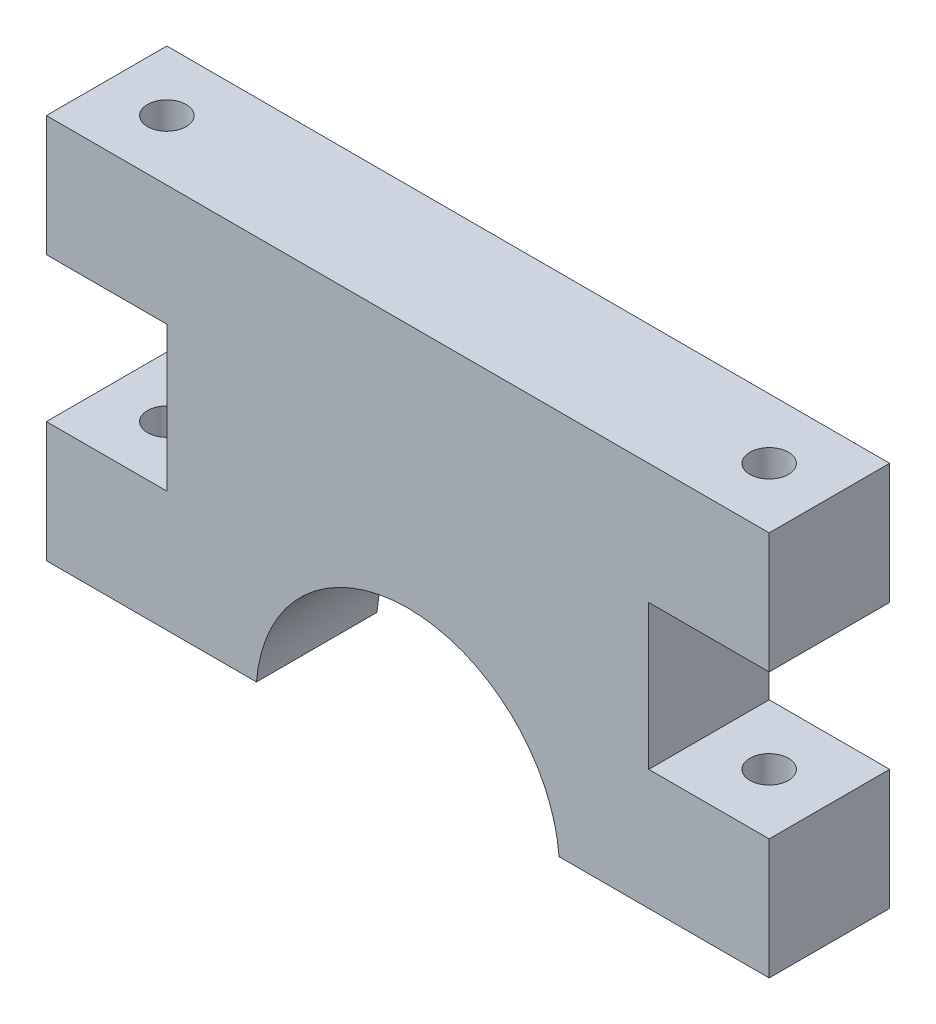
ISO-10303-21;
HEADER;
FILE_DESCRIPTION(('STEP AP214'),'2;1');
FILE_NAME('part.step','',(''),(''),'','','');
FILE_SCHEMA(('AUTOMOTIVE_DESIGN { 1 0 10303 214 1 1 1 1 }'));
ENDSEC;
DATA;
#1=APPLICATION_CONTEXT('core data for automotive mechanical design processes');
#2=APPLICATION_PROTOCOL_DEFINITION('international standard','automotive_design',2000,#1);
#3=PRODUCT_CONTEXT('',#1,'mechanical');
#4=PRODUCT('Part','Part','',(#3));
#5=PRODUCT_RELATED_PRODUCT_CATEGORY('part','',(#4));
#6=PRODUCT_DEFINITION_FORMATION('','',#4);
#7=PRODUCT_DEFINITION_CONTEXT('part definition',#1,'design');
#8=PRODUCT_DEFINITION('design','',#6,#7);
#9=PRODUCT_DEFINITION_SHAPE('','',#8);
#10=(LENGTH_UNIT() NAMED_UNIT(*) SI_UNIT(.MILLI.,.METRE.));
#11=(NAMED_UNIT(*) PLANE_ANGLE_UNIT() SI_UNIT($,.RADIAN.));
#12=(NAMED_UNIT(*) SI_UNIT($,.STERADIAN.) SOLID_ANGLE_UNIT());
#13=UNCERTAINTY_MEASURE_WITH_UNIT(LENGTH_MEASURE(1.E-05),#10,'distance_accuracy_value','');
#14=(GEOMETRIC_REPRESENTATION_CONTEXT(3) GLOBAL_UNCERTAINTY_ASSIGNED_CONTEXT((#13)) GLOBAL_UNIT_ASSIGNED_CONTEXT((#10,
#11,#12)) REPRESENTATION_CONTEXT('',''));
#15=CARTESIAN_POINT('',(0.,0.,0.));
#16=DIRECTION('',(0.,0.,1.));
#17=DIRECTION('',(1.,0.,0.));
#18=AXIS2_PLACEMENT_3D('',#15,#16,#17);
#19=CARTESIAN_POINT('',(0.,16.,10.));
#20=DIRECTION('',(0.,-1.,0.));
#21=DIRECTION('',(0.,0.,-1.));
#22=AXIS2_PLACEMENT_3D('',#19,#20,#21);
#23=PLANE('',#22);
#24=CARTESIAN_POINT('',(-25.,16.,5.));
#25=DIRECTION('',(0.,1.,0.));
#26=DIRECTION('',(0.,0.,1.));
#27=AXIS2_PLACEMENT_3D('',#24,#25,#26);
#28=CIRCLE('',#27,1.6);
#29=CARTESIAN_POINT('',(-25.,16.,6.6));
#30=VERTEX_POINT('',#29);
#31=EDGE_CURVE('E334',#30,#30,#28,.T.);
#32=ORIENTED_EDGE('',*,*,#31,.F.);
#33=EDGE_LOOP('',(#32));
#34=FACE_BOUND('',#33,.T.);
#35=CARTESIAN_POINT('',(25.,16.,5.));
#36=DIRECTION('',(0.,1.,0.));
#37=DIRECTION('',(0.,0.,-1.));
#38=AXIS2_PLACEMENT_3D('',#35,#36,#37);
#39=CIRCLE('',#38,1.6);
#40=CARTESIAN_POINT('',(25.,16.,3.4));
#41=VERTEX_POINT('',#40);
#42=EDGE_CURVE('E337',#41,#41,#39,.T.);
#43=ORIENTED_EDGE('',*,*,#42,.F.);
#44=EDGE_LOOP('',(#43));
#45=FACE_BOUND('',#44,.T.);
#46=DIRECTION('',(-1.,0.,0.));
#47=VECTOR('',#46,1.);
#48=CARTESIAN_POINT('',(0.,16.,0.));
#49=LINE('',#48,#47);
#50=CARTESIAN_POINT('',(30.,16.,0.));
#51=VERTEX_POINT('',#50);
#52=CARTESIAN_POINT('',(-30.,16.,0.));
#53=VERTEX_POINT('',#52);
#54=EDGE_CURVE('E179',#51,#53,#49,.T.);
#55=ORIENTED_EDGE('',*,*,#54,.T.);
#56=DIRECTION('',(0.,0.,-1.));
#57=VECTOR('',#56,1.);
#58=CARTESIAN_POINT('',(-30.,16.,10.));
#59=LINE('',#58,#57);
#60=CARTESIAN_POINT('',(-30.,16.,10.));
#61=VERTEX_POINT('',#60);
#62=EDGE_CURVE('E11',#61,#53,#59,.T.);
#63=ORIENTED_EDGE('',*,*,#62,.F.);
#64=DIRECTION('',(-1.,0.,0.));
#65=VECTOR('',#64,1.);
#66=CARTESIAN_POINT('',(0.,16.,10.));
#67=LINE('',#66,#65);
#68=CARTESIAN_POINT('',(30.,16.,10.));
#69=VERTEX_POINT('',#68);
#70=EDGE_CURVE('E231',#69,#61,#67,.T.);
#71=ORIENTED_EDGE('',*,*,#70,.F.);
#72=DIRECTION('',(0.,0.,-1.));
#73=VECTOR('',#72,1.);
#74=CARTESIAN_POINT('',(30.,16.,10.));
#75=LINE('',#74,#73);
#76=EDGE_CURVE('E59',#69,#51,#75,.T.);
#77=ORIENTED_EDGE('',*,*,#76,.T.);
#78=EDGE_LOOP('',(#55,#63,#71,#77));
#79=FACE_BOUND('',#78,.T.);
#80=ADVANCED_FACE('F41',(#34,#45,#79),#23,.F.);
#81=CARTESIAN_POINT('',(-30.,0.,10.));
#82=DIRECTION('',(1.,0.,0.));
#83=DIRECTION('',(0.,1.,0.));
#84=AXIS2_PLACEMENT_3D('',#81,#82,#83);
#85=PLANE('',#84);
#86=DIRECTION('',(0.,-1.,0.));
#87=VECTOR('',#86,1.);
#88=CARTESIAN_POINT('',(-30.,0.,0.));
#89=LINE('',#88,#87);
#90=CARTESIAN_POINT('',(-30.,6.,0.));
#91=VERTEX_POINT('',#90);
#92=EDGE_CURVE('E182',#53,#91,#89,.T.);
#93=ORIENTED_EDGE('',*,*,#92,.T.);
#94=DIRECTION('',(0.,0.,-1.));
#95=VECTOR('',#94,1.);
#96=CARTESIAN_POINT('',(-30.,6.,10.));
#97=LINE('',#96,#95);
#98=CARTESIAN_POINT('',(-30.,6.,10.));
#99=VERTEX_POINT('',#98);
#100=EDGE_CURVE('E51',#99,#91,#97,.T.);
#101=ORIENTED_EDGE('',*,*,#100,.F.);
#102=DIRECTION('',(0.,-1.,0.));
#103=VECTOR('',#102,1.);
#104=CARTESIAN_POINT('',(-30.,0.,10.));
#105=LINE('',#104,#103);
#106=EDGE_CURVE('E116',#61,#99,#105,.T.);
#107=ORIENTED_EDGE('',*,*,#106,.F.);
#108=ORIENTED_EDGE('',*,*,#62,.T.);
#109=EDGE_LOOP('',(#93,#101,#107,#108));
#110=FACE_BOUND('',#109,.T.);
#111=ADVANCED_FACE('F270',(#110),#85,.F.);
#112=CARTESIAN_POINT('',(0.,6.00000000000001,10.));
#113=DIRECTION('',(0.,-1.,0.));
#114=DIRECTION('',(1.,0.,0.));
#115=AXIS2_PLACEMENT_3D('',#112,#113,#114);
#116=PLANE('',#115);
#117=CARTESIAN_POINT('',(-25.,6.,5.));
#118=DIRECTION('',(0.,-1.,0.));
#119=DIRECTION('',(1.,0.,0.));
#120=AXIS2_PLACEMENT_3D('',#117,#118,#119);
#121=CIRCLE('',#120,1.6);
#122=CARTESIAN_POINT('',(-23.4,6.,5.));
#123=VERTEX_POINT('',#122);
#124=EDGE_CURVE('E183',#123,#123,#121,.T.);
#125=ORIENTED_EDGE('',*,*,#124,.F.);
#126=EDGE_LOOP('',(#125));
#127=FACE_BOUND('',#126,.T.);
#128=DIRECTION('',(-1.,0.,0.));
#129=VECTOR('',#128,1.);
#130=CARTESIAN_POINT('',(0.,6.00000000000001,0.));
#131=LINE('',#130,#129);
#132=CARTESIAN_POINT('',(-20.,6.,0.));
#133=VERTEX_POINT('',#132);
#134=EDGE_CURVE('E187',#133,#91,#131,.T.);
#135=ORIENTED_EDGE('',*,*,#134,.F.);
#136=DIRECTION('',(0.,0.,-1.));
#137=VECTOR('',#136,1.);
#138=CARTESIAN_POINT('',(-20.,6.,10.));
#139=LINE('',#138,#137);
#140=CARTESIAN_POINT('',(-20.,6.,10.));
#141=VERTEX_POINT('',#140);
#142=EDGE_CURVE('E260',#141,#133,#139,.T.);
#143=ORIENTED_EDGE('',*,*,#142,.F.);
#144=DIRECTION('',(-1.,0.,0.));
#145=VECTOR('',#144,1.);
#146=CARTESIAN_POINT('',(0.,6.00000000000001,10.));
#147=LINE('',#146,#145);
#148=EDGE_CURVE('E269',#141,#99,#147,.T.);
#149=ORIENTED_EDGE('',*,*,#148,.T.);
#150=ORIENTED_EDGE('',*,*,#100,.T.);
#151=EDGE_LOOP('',(#135,#143,#149,#150));
#152=FACE_BOUND('',#151,.T.);
#153=ADVANCED_FACE('F267',(#127,#152),#116,.T.);
#154=CARTESIAN_POINT('',(-20.,0.,10.));
#155=DIRECTION('',(-1.,0.,0.));
#156=DIRECTION('',(0.,0.,1.));
#157=AXIS2_PLACEMENT_3D('',#154,#155,#156);
#158=PLANE('',#157);
#159=DIRECTION('',(0.,1.,0.));
#160=VECTOR('',#159,1.);
#161=CARTESIAN_POINT('',(-20.,0.,0.));
#162=LINE('',#161,#160);
#163=CARTESIAN_POINT('',(-20.,-6.,0.));
#164=VERTEX_POINT('',#163);
#165=EDGE_CURVE('E191',#164,#133,#162,.T.);
#166=ORIENTED_EDGE('',*,*,#165,.F.);
#167=DIRECTION('',(0.,0.,-1.));
#168=VECTOR('',#167,1.);
#169=CARTESIAN_POINT('',(-20.,-6.,10.));
#170=LINE('',#169,#168);
#171=CARTESIAN_POINT('',(-20.,-6.,10.));
#172=VERTEX_POINT('',#171);
#173=EDGE_CURVE('E257',#172,#164,#170,.T.);
#174=ORIENTED_EDGE('',*,*,#173,.F.);
#175=DIRECTION('',(0.,1.,0.));
#176=VECTOR('',#175,1.);
#177=CARTESIAN_POINT('',(-20.,0.,10.));
#178=LINE('',#177,#176);
#179=EDGE_CURVE('E281',#172,#141,#178,.T.);
#180=ORIENTED_EDGE('',*,*,#179,.T.);
#181=ORIENTED_EDGE('',*,*,#142,.T.);
#182=EDGE_LOOP('',(#166,#174,#180,#181));
#183=FACE_BOUND('',#182,.T.);
#184=ADVANCED_FACE('F277',(#183),#158,.T.);
#185=CARTESIAN_POINT('',(0.,-6.,10.));
#186=DIRECTION('',(0.,-1.,0.));
#187=DIRECTION('',(1.,0.,0.));
#188=AXIS2_PLACEMENT_3D('',#185,#186,#187);
#189=PLANE('',#188);
#190=CARTESIAN_POINT('',(-25.,-6.,5.));
#191=DIRECTION('',(0.,-1.,0.));
#192=DIRECTION('',(1.,0.,0.));
#193=AXIS2_PLACEMENT_3D('',#190,#191,#192);
#194=CIRCLE('',#193,1.6);
#195=CARTESIAN_POINT('',(-23.4,-6.,5.));
#196=VERTEX_POINT('',#195);
#197=EDGE_CURVE('E343',#196,#196,#194,.T.);
#198=ORIENTED_EDGE('',*,*,#197,.T.);
#199=EDGE_LOOP('',(#198));
#200=FACE_BOUND('',#199,.T.);
#201=DIRECTION('',(-1.,0.,0.));
#202=VECTOR('',#201,1.);
#203=CARTESIAN_POINT('',(0.,-6.,0.));
#204=LINE('',#203,#202);
#205=CARTESIAN_POINT('',(-30.,-6.,0.));
#206=VERTEX_POINT('',#205);
#207=EDGE_CURVE('E195',#164,#206,#204,.T.);
#208=ORIENTED_EDGE('',*,*,#207,.T.);
#209=DIRECTION('',(0.,0.,-1.));
#210=VECTOR('',#209,1.);
#211=CARTESIAN_POINT('',(-30.,-6.,10.));
#212=LINE('',#211,#210);
#213=CARTESIAN_POINT('',(-30.,-6.,10.));
#214=VERTEX_POINT('',#213);
#215=EDGE_CURVE('E254',#214,#206,#212,.T.);
#216=ORIENTED_EDGE('',*,*,#215,.F.);
#217=DIRECTION('',(-1.,0.,0.));
#218=VECTOR('',#217,1.);
#219=CARTESIAN_POINT('',(0.,-6.,10.));
#220=LINE('',#219,#218);
#221=EDGE_CURVE('E286',#172,#214,#220,.T.);
#222=ORIENTED_EDGE('',*,*,#221,.F.);
#223=ORIENTED_EDGE('',*,*,#173,.T.);
#224=EDGE_LOOP('',(#208,#216,#222,#223));
#225=FACE_BOUND('',#224,.T.);
#226=ADVANCED_FACE('F395',(#200,#225),#189,.F.);
#227=CARTESIAN_POINT('',(-30.,0.,10.));
#228=DIRECTION('',(-1.,0.,0.));
#229=DIRECTION('',(0.,0.,1.));
#230=AXIS2_PLACEMENT_3D('',#227,#228,#229);
#231=PLANE('',#230);
#232=DIRECTION('',(0.,1.,0.));
#233=VECTOR('',#232,1.);
#234=CARTESIAN_POINT('',(-30.,0.,0.));
#235=LINE('',#234,#233);
#236=CARTESIAN_POINT('',(-30.,-16.,0.));
#237=VERTEX_POINT('',#236);
#238=EDGE_CURVE('E199',#237,#206,#235,.T.);
#239=ORIENTED_EDGE('',*,*,#238,.F.);
#240=DIRECTION('',(0.,0.,-1.));
#241=VECTOR('',#240,1.);
#242=CARTESIAN_POINT('',(-30.,-16.,10.));
#243=LINE('',#242,#241);
#244=CARTESIAN_POINT('',(-30.,-16.,10.));
#245=VERTEX_POINT('',#244);
#246=EDGE_CURVE('E251',#245,#237,#243,.T.);
#247=ORIENTED_EDGE('',*,*,#246,.F.);
#248=DIRECTION('',(0.,1.,0.));
#249=VECTOR('',#248,1.);
#250=CARTESIAN_POINT('',(-30.,0.,10.));
#251=LINE('',#250,#249);
#252=EDGE_CURVE('E293',#245,#214,#251,.T.);
#253=ORIENTED_EDGE('',*,*,#252,.T.);
#254=ORIENTED_EDGE('',*,*,#215,.T.);
#255=EDGE_LOOP('',(#239,#247,#253,#254));
#256=FACE_BOUND('',#255,.T.);
#257=ADVANCED_FACE('F400',(#256),#231,.T.);
#258=CARTESIAN_POINT('',(0.,-16.,10.));
#259=DIRECTION('',(0.,1.,0.));
#260=DIRECTION('',(0.,0.,1.));
#261=AXIS2_PLACEMENT_3D('',#258,#259,#260);
#262=PLANE('',#261);
#263=CARTESIAN_POINT('',(-25.,-16.,5.));
#264=DIRECTION('',(0.,1.,0.));
#265=DIRECTION('',(0.,0.,1.));
#266=AXIS2_PLACEMENT_3D('',#263,#264,#265);
#267=CIRCLE('',#266,1.6);
#268=CARTESIAN_POINT('',(-25.,-16.,6.6));
#269=VERTEX_POINT('',#268);
#270=EDGE_CURVE('E359',#269,#269,#267,.T.);
#271=ORIENTED_EDGE('',*,*,#270,.T.);
#272=EDGE_LOOP('',(#271));
#273=FACE_BOUND('',#272,.T.);
#274=DIRECTION('',(1.,0.,0.));
#275=VECTOR('',#274,1.);
#276=CARTESIAN_POINT('',(0.,-16.,0.));
#277=LINE('',#276,#275);
#278=CARTESIAN_POINT('',(-12.5602547744861,-16.,0.));
#279=VERTEX_POINT('',#278);
#280=EDGE_CURVE('E203',#237,#279,#277,.T.);
#281=ORIENTED_EDGE('',*,*,#280,.T.);
#282=DIRECTION('',(0.,0.,-1.));
#283=VECTOR('',#282,1.);
#284=CARTESIAN_POINT('',(-12.5602547744861,-16.,10.));
#285=LINE('',#284,#283);
#286=CARTESIAN_POINT('',(-12.5602547744861,-16.,10.));
#287=VERTEX_POINT('',#286);
#288=EDGE_CURVE('E248',#287,#279,#285,.T.);
#289=ORIENTED_EDGE('',*,*,#288,.F.);
#290=DIRECTION('',(1.,0.,0.));
#291=VECTOR('',#290,1.);
#292=CARTESIAN_POINT('',(0.,-16.,10.));
#293=LINE('',#292,#291);
#294=EDGE_CURVE('E297',#245,#287,#293,.T.);
#295=ORIENTED_EDGE('',*,*,#294,.F.);
#296=ORIENTED_EDGE('',*,*,#246,.T.);
#297=EDGE_LOOP('',(#281,#289,#295,#296));
#298=FACE_BOUND('',#297,.T.);
#299=ADVANCED_FACE('F404',(#273,#298),#262,.F.);
#300=CARTESIAN_POINT('',(0.,-17.,10.));
#301=DIRECTION('',(0.,0.,-1.));
#302=DIRECTION('',(-1.,0.,0.));
#303=AXIS2_PLACEMENT_3D('',#300,#301,#302);
#304=CYLINDRICAL_SURFACE('',#303,12.6);
#305=CARTESIAN_POINT('',(0.,-17.,0.));
#306=DIRECTION('',(0.,0.,1.));
#307=DIRECTION('',(1.,0.,0.));
#308=AXIS2_PLACEMENT_3D('',#305,#306,#307);
#309=CIRCLE('',#308,12.6);
#310=CARTESIAN_POINT('',(12.5602547744861,-16.,0.));
#311=VERTEX_POINT('',#310);
#312=EDGE_CURVE('E207',#311,#279,#309,.T.);
#313=ORIENTED_EDGE('',*,*,#312,.F.);
#314=DIRECTION('',(0.,0.,-1.));
#315=VECTOR('',#314,1.);
#316=CARTESIAN_POINT('',(12.5602547744861,-16.,10.));
#317=LINE('',#316,#315);
#318=CARTESIAN_POINT('',(12.5602547744861,-16.,10.));
#319=VERTEX_POINT('',#318);
#320=EDGE_CURVE('E245',#319,#311,#317,.T.);
#321=ORIENTED_EDGE('',*,*,#320,.F.);
#322=CARTESIAN_POINT('',(0.,-17.,10.));
#323=DIRECTION('',(0.,0.,1.));
#324=DIRECTION('',(1.,0.,0.));
#325=AXIS2_PLACEMENT_3D('',#322,#323,#324);
#326=CIRCLE('',#325,12.6);
#327=EDGE_CURVE('E300',#319,#287,#326,.T.);
#328=ORIENTED_EDGE('',*,*,#327,.T.);
#329=ORIENTED_EDGE('',*,*,#288,.T.);
#330=EDGE_LOOP('',(#313,#321,#328,#329));
#331=FACE_BOUND('',#330,.T.);
#332=ADVANCED_FACE('F408',(#331),#304,.F.);
#333=CARTESIAN_POINT('',(0.,-16.,10.));
#334=DIRECTION('',(0.,1.,0.));
#335=DIRECTION('',(0.,0.,1.));
#336=AXIS2_PLACEMENT_3D('',#333,#334,#335);
#337=PLANE('',#336);
#338=CARTESIAN_POINT('',(25.,-16.,5.));
#339=DIRECTION('',(0.,1.,0.));
#340=DIRECTION('',(0.,0.,-1.));
#341=AXIS2_PLACEMENT_3D('',#338,#339,#340);
#342=CIRCLE('',#341,1.6);
#343=CARTESIAN_POINT('',(25.,-16.,3.4));
#344=VERTEX_POINT('',#343);
#345=EDGE_CURVE('E353',#344,#344,#342,.T.);
#346=ORIENTED_EDGE('',*,*,#345,.T.);
#347=EDGE_LOOP('',(#346));
#348=FACE_BOUND('',#347,.T.);
#349=DIRECTION('',(1.,0.,0.));
#350=VECTOR('',#349,1.);
#351=CARTESIAN_POINT('',(0.,-16.,0.));
#352=LINE('',#351,#350);
#353=CARTESIAN_POINT('',(30.,-16.,0.));
#354=VERTEX_POINT('',#353);
#355=EDGE_CURVE('E211',#311,#354,#352,.T.);
#356=ORIENTED_EDGE('',*,*,#355,.T.);
#357=DIRECTION('',(0.,0.,-1.));
#358=VECTOR('',#357,1.);
#359=CARTESIAN_POINT('',(30.,-16.,10.));
#360=LINE('',#359,#358);
#361=CARTESIAN_POINT('',(30.,-16.,10.));
#362=VERTEX_POINT('',#361);
#363=EDGE_CURVE('E241',#362,#354,#360,.T.);
#364=ORIENTED_EDGE('',*,*,#363,.F.);
#365=DIRECTION('',(1.,0.,0.));
#366=VECTOR('',#365,1.);
#367=CARTESIAN_POINT('',(0.,-16.,10.));
#368=LINE('',#367,#366);
#369=EDGE_CURVE('E304',#319,#362,#368,.T.);
#370=ORIENTED_EDGE('',*,*,#369,.F.);
#371=ORIENTED_EDGE('',*,*,#320,.T.);
#372=EDGE_LOOP('',(#356,#364,#370,#371));
#373=FACE_BOUND('',#372,.T.);
#374=ADVANCED_FACE('F411',(#348,#373),#337,.F.);
#375=CARTESIAN_POINT('',(30.,0.,10.));
#376=DIRECTION('',(-1.,0.,0.));
#377=DIRECTION('',(0.,0.,1.));
#378=AXIS2_PLACEMENT_3D('',#375,#376,#377);
#379=PLANE('',#378);
#380=DIRECTION('',(0.,1.,0.));
#381=VECTOR('',#380,1.);
#382=CARTESIAN_POINT('',(30.,0.,0.));
#383=LINE('',#382,#381);
#384=CARTESIAN_POINT('',(30.,-6.00000000000001,0.));
#385=VERTEX_POINT('',#384);
#386=EDGE_CURVE('E214',#354,#385,#383,.T.);
#387=ORIENTED_EDGE('',*,*,#386,.T.);
#388=DIRECTION('',(0.,0.,-1.));
#389=VECTOR('',#388,1.);
#390=CARTESIAN_POINT('',(30.,-6.00000000000001,10.));
#391=LINE('',#390,#389);
#392=CARTESIAN_POINT('',(30.,-6.00000000000001,10.));
#393=VERTEX_POINT('',#392);
#394=EDGE_CURVE('E238',#393,#385,#391,.T.);
#395=ORIENTED_EDGE('',*,*,#394,.F.);
#396=DIRECTION('',(0.,1.,0.));
#397=VECTOR('',#396,1.);
#398=CARTESIAN_POINT('',(30.,0.,10.));
#399=LINE('',#398,#397);
#400=EDGE_CURVE('E307',#362,#393,#399,.T.);
#401=ORIENTED_EDGE('',*,*,#400,.F.);
#402=ORIENTED_EDGE('',*,*,#363,.T.);
#403=EDGE_LOOP('',(#387,#395,#401,#402));
#404=FACE_BOUND('',#403,.T.);
#405=ADVANCED_FACE('F415',(#404),#379,.F.);
#406=CARTESIAN_POINT('',(0.,-6.00000000000001,10.));
#407=DIRECTION('',(0.,1.,0.));
#408=DIRECTION('',(0.,0.,1.));
#409=AXIS2_PLACEMENT_3D('',#406,#407,#408);
#410=PLANE('',#409);
#411=CARTESIAN_POINT('',(25.,-6.00000000000001,5.));
#412=DIRECTION('',(0.,1.,0.));
#413=DIRECTION('',(0.,0.,1.));
#414=AXIS2_PLACEMENT_3D('',#411,#412,#413);
#415=CIRCLE('',#414,1.6);
#416=CARTESIAN_POINT('',(25.,-6.00000000000001,6.6));
#417=VERTEX_POINT('',#416);
#418=EDGE_CURVE('E347',#417,#417,#415,.T.);
#419=ORIENTED_EDGE('',*,*,#418,.F.);
#420=EDGE_LOOP('',(#419));
#421=FACE_BOUND('',#420,.T.);
#422=DIRECTION('',(1.,0.,0.));
#423=VECTOR('',#422,1.);
#424=CARTESIAN_POINT('',(0.,-6.00000000000001,0.));
#425=LINE('',#424,#423);
#426=CARTESIAN_POINT('',(20.,-6.00000000000001,0.));
#427=VERTEX_POINT('',#426);
#428=EDGE_CURVE('E218',#427,#385,#425,.T.);
#429=ORIENTED_EDGE('',*,*,#428,.F.);
#430=DIRECTION('',(0.,0.,-1.));
#431=VECTOR('',#430,1.);
#432=CARTESIAN_POINT('',(20.,-6.00000000000001,10.));
#433=LINE('',#432,#431);
#434=CARTESIAN_POINT('',(20.,-6.00000000000001,10.));
#435=VERTEX_POINT('',#434);
#436=EDGE_CURVE('E169',#435,#427,#433,.T.);
#437=ORIENTED_EDGE('',*,*,#436,.F.);
#438=DIRECTION('',(1.,0.,0.));
#439=VECTOR('',#438,1.);
#440=CARTESIAN_POINT('',(0.,-6.00000000000001,10.));
#441=LINE('',#440,#439);
#442=EDGE_CURVE('E157',#435,#393,#441,.T.);
#443=ORIENTED_EDGE('',*,*,#442,.T.);
#444=ORIENTED_EDGE('',*,*,#394,.T.);
#445=EDGE_LOOP('',(#429,#437,#443,#444));
#446=FACE_BOUND('',#445,.T.);
#447=ADVANCED_FACE('F312',(#421,#446),#410,.T.);
#448=CARTESIAN_POINT('',(20.,0.,10.));
#449=DIRECTION('',(-1.,0.,0.));
#450=DIRECTION('',(0.,0.,1.));
#451=AXIS2_PLACEMENT_3D('',#448,#449,#450);
#452=PLANE('',#451);
#453=DIRECTION('',(0.,1.,0.));
#454=VECTOR('',#453,1.);
#455=CARTESIAN_POINT('',(20.,0.,0.));
#456=LINE('',#455,#454);
#457=CARTESIAN_POINT('',(20.,6.,0.));
#458=VERTEX_POINT('',#457);
#459=EDGE_CURVE('E165',#427,#458,#456,.T.);
#460=ORIENTED_EDGE('',*,*,#459,.T.);
#461=DIRECTION('',(0.,0.,-1.));
#462=VECTOR('',#461,1.);
#463=CARTESIAN_POINT('',(20.,6.,10.));
#464=LINE('',#463,#462);
#465=CARTESIAN_POINT('',(20.,6.,10.));
#466=VERTEX_POINT('',#465);
#467=EDGE_CURVE('E162',#466,#458,#464,.T.);
#468=ORIENTED_EDGE('',*,*,#467,.F.);
#469=DIRECTION('',(0.,1.,0.));
#470=VECTOR('',#469,1.);
#471=CARTESIAN_POINT('',(20.,0.,10.));
#472=LINE('',#471,#470);
#473=EDGE_CURVE('E150',#435,#466,#472,.T.);
#474=ORIENTED_EDGE('',*,*,#473,.F.);
#475=ORIENTED_EDGE('',*,*,#436,.T.);
#476=EDGE_LOOP('',(#460,#468,#474,#475));
#477=FACE_BOUND('',#476,.T.);
#478=ADVANCED_FACE('F163',(#477),#452,.F.);
#479=CARTESIAN_POINT('',(0.,6.,10.));
#480=DIRECTION('',(0.,1.,0.));
#481=DIRECTION('',(-1.,0.,0.));
#482=AXIS2_PLACEMENT_3D('',#479,#480,#481);
#483=PLANE('',#482);
#484=CARTESIAN_POINT('',(25.,6.00000000000001,5.));
#485=DIRECTION('',(0.,1.,0.));
#486=DIRECTION('',(-1.,0.,0.));
#487=AXIS2_PLACEMENT_3D('',#484,#485,#486);
#488=CIRCLE('',#487,1.6);
#489=CARTESIAN_POINT('',(23.4,6.00000000000001,5.));
#490=VERTEX_POINT('',#489);
#491=EDGE_CURVE('E44',#490,#490,#488,.T.);
#492=ORIENTED_EDGE('',*,*,#491,.T.);
#493=EDGE_LOOP('',(#492));
#494=FACE_BOUND('',#493,.T.);
#495=DIRECTION('',(1.,0.,0.));
#496=VECTOR('',#495,1.);
#497=CARTESIAN_POINT('',(0.,6.,0.));
#498=LINE('',#497,#496);
#499=CARTESIAN_POINT('',(30.,6.00000000000001,0.));
#500=VERTEX_POINT('',#499);
#501=EDGE_CURVE('E224',#458,#500,#498,.T.);
#502=ORIENTED_EDGE('',*,*,#501,.T.);
#503=DIRECTION('',(0.,0.,-1.));
#504=VECTOR('',#503,1.);
#505=CARTESIAN_POINT('',(30.,6.00000000000001,10.));
#506=LINE('',#505,#504);
#507=CARTESIAN_POINT('',(30.,6.00000000000001,10.));
#508=VERTEX_POINT('',#507);
#509=EDGE_CURVE('E104',#508,#500,#506,.T.);
#510=ORIENTED_EDGE('',*,*,#509,.F.);
#511=DIRECTION('',(1.,0.,0.));
#512=VECTOR('',#511,1.);
#513=CARTESIAN_POINT('',(0.,6.,10.));
#514=LINE('',#513,#512);
#515=EDGE_CURVE('E155',#466,#508,#514,.T.);
#516=ORIENTED_EDGE('',*,*,#515,.F.);
#517=ORIENTED_EDGE('',*,*,#467,.T.);
#518=EDGE_LOOP('',(#502,#510,#516,#517));
#519=FACE_BOUND('',#518,.T.);
#520=ADVANCED_FACE('F171',(#494,#519),#483,.F.);
#521=CARTESIAN_POINT('',(30.,0.,10.));
#522=DIRECTION('',(1.,0.,0.));
#523=DIRECTION('',(0.,1.,0.));
#524=AXIS2_PLACEMENT_3D('',#521,#522,#523);
#525=PLANE('',#524);
#526=DIRECTION('',(0.,-1.,0.));
#527=VECTOR('',#526,1.);
#528=CARTESIAN_POINT('',(30.,0.,0.));
#529=LINE('',#528,#527);
#530=EDGE_CURVE('E227',#51,#500,#529,.T.);
#531=ORIENTED_EDGE('',*,*,#530,.F.);
#532=ORIENTED_EDGE('',*,*,#76,.F.);
#533=DIRECTION('',(0.,-1.,0.));
#534=VECTOR('',#533,1.);
#535=CARTESIAN_POINT('',(30.,0.,10.));
#536=LINE('',#535,#534);
#537=EDGE_CURVE('E173',#69,#508,#536,.T.);
#538=ORIENTED_EDGE('',*,*,#537,.T.);
#539=ORIENTED_EDGE('',*,*,#509,.T.);
#540=EDGE_LOOP('',(#531,#532,#538,#539));
#541=FACE_BOUND('',#540,.T.);
#542=ADVANCED_FACE('F315',(#541),#525,.T.);
#543=CARTESIAN_POINT('',(0.,0.,10.));
#544=DIRECTION('',(0.,0.,1.));
#545=DIRECTION('',(1.,0.,0.));
#546=AXIS2_PLACEMENT_3D('',#543,#544,#545);
#547=PLANE('',#546);
#548=ORIENTED_EDGE('',*,*,#70,.T.);
#549=ORIENTED_EDGE('',*,*,#106,.T.);
#550=ORIENTED_EDGE('',*,*,#148,.F.);
#551=ORIENTED_EDGE('',*,*,#179,.F.);
#552=ORIENTED_EDGE('',*,*,#221,.T.);
#553=ORIENTED_EDGE('',*,*,#252,.F.);
#554=ORIENTED_EDGE('',*,*,#294,.T.);
#555=ORIENTED_EDGE('',*,*,#327,.F.);
#556=ORIENTED_EDGE('',*,*,#369,.T.);
#557=ORIENTED_EDGE('',*,*,#400,.T.);
#558=ORIENTED_EDGE('',*,*,#442,.F.);
#559=ORIENTED_EDGE('',*,*,#473,.T.);
#560=ORIENTED_EDGE('',*,*,#515,.T.);
#561=ORIENTED_EDGE('',*,*,#537,.F.);
#562=EDGE_LOOP('',(#548,#549,#550,#551,#552,#553,#554,#555,#556,#557,#558,#559,#560,#561));
#563=FACE_BOUND('',#562,.T.);
#564=ADVANCED_FACE('F152',(#563),#547,.T.);
#565=CARTESIAN_POINT('',(0.,0.,0.));
#566=DIRECTION('',(0.,0.,1.));
#567=DIRECTION('',(1.,0.,0.));
#568=AXIS2_PLACEMENT_3D('',#565,#566,#567);
#569=PLANE('',#568);
#570=ORIENTED_EDGE('',*,*,#54,.F.);
#571=ORIENTED_EDGE('',*,*,#530,.T.);
#572=ORIENTED_EDGE('',*,*,#501,.F.);
#573=ORIENTED_EDGE('',*,*,#459,.F.);
#574=ORIENTED_EDGE('',*,*,#428,.T.);
#575=ORIENTED_EDGE('',*,*,#386,.F.);
#576=ORIENTED_EDGE('',*,*,#355,.F.);
#577=ORIENTED_EDGE('',*,*,#312,.T.);
#578=ORIENTED_EDGE('',*,*,#280,.F.);
#579=ORIENTED_EDGE('',*,*,#238,.T.);
#580=ORIENTED_EDGE('',*,*,#207,.F.);
#581=ORIENTED_EDGE('',*,*,#165,.T.);
#582=ORIENTED_EDGE('',*,*,#134,.T.);
#583=ORIENTED_EDGE('',*,*,#92,.F.);
#584=EDGE_LOOP('',(#570,#571,#572,#573,#574,#575,#576,#577,#578,#579,#580,#581,#582,#583));
#585=FACE_BOUND('',#584,.T.);
#586=ADVANCED_FACE('F273',(#585),#569,.F.);
#587=CARTESIAN_POINT('',(25.,-16.,5.));
#588=DIRECTION('',(0.,1.,0.));
#589=DIRECTION('',(0.,0.,1.));
#590=AXIS2_PLACEMENT_3D('',#587,#588,#589);
#591=CYLINDRICAL_SURFACE('',#590,1.6);
#592=ORIENTED_EDGE('',*,*,#42,.T.);
#593=EDGE_LOOP('',(#592));
#594=FACE_BOUND('',#593,.T.);
#595=ORIENTED_EDGE('',*,*,#491,.F.);
#596=EDGE_LOOP('',(#595));
#597=FACE_BOUND('',#596,.T.);
#598=ADVANCED_FACE('F368',(#594,#597),#591,.F.);
#599=ORIENTED_EDGE('',*,*,#418,.T.);
#600=EDGE_LOOP('',(#599));
#601=FACE_BOUND('',#600,.T.);
#602=ORIENTED_EDGE('',*,*,#345,.F.);
#603=EDGE_LOOP('',(#602));
#604=FACE_BOUND('',#603,.T.);
#605=ADVANCED_FACE('F370',(#601,#604),#591,.F.);
#606=CARTESIAN_POINT('',(-25.,-16.,5.));
#607=DIRECTION('',(0.,1.,0.));
#608=DIRECTION('',(0.,0.,1.));
#609=AXIS2_PLACEMENT_3D('',#606,#607,#608);
#610=CYLINDRICAL_SURFACE('',#609,1.6);
#611=ORIENTED_EDGE('',*,*,#270,.F.);
#612=EDGE_LOOP('',(#611));
#613=FACE_BOUND('',#612,.T.);
#614=ORIENTED_EDGE('',*,*,#197,.F.);
#615=EDGE_LOOP('',(#614));
#616=FACE_BOUND('',#615,.T.);
#617=ADVANCED_FACE('F377',(#613,#616),#610,.F.);
#618=ORIENTED_EDGE('',*,*,#124,.T.);
#619=EDGE_LOOP('',(#618));
#620=FACE_BOUND('',#619,.T.);
#621=ORIENTED_EDGE('',*,*,#31,.T.);
#622=EDGE_LOOP('',(#621));
#623=FACE_BOUND('',#622,.T.);
#624=ADVANCED_FACE('F380',(#620,#623),#610,.F.);
#625=CLOSED_SHELL('',(#80,#111,#153,#184,#226,#257,#299,#332,#374,#405,#447,#478,#520,#542,#564,
#586,#598,#605,#617,#624));
#626=MANIFOLD_SOLID_BREP('B2',#625);
#627=ADVANCED_BREP_SHAPE_REPRESENTATION('',(#18,#626),#14);
#628=SHAPE_DEFINITION_REPRESENTATION(#9,#627);
ENDSEC;
END-ISO-10303-21;
